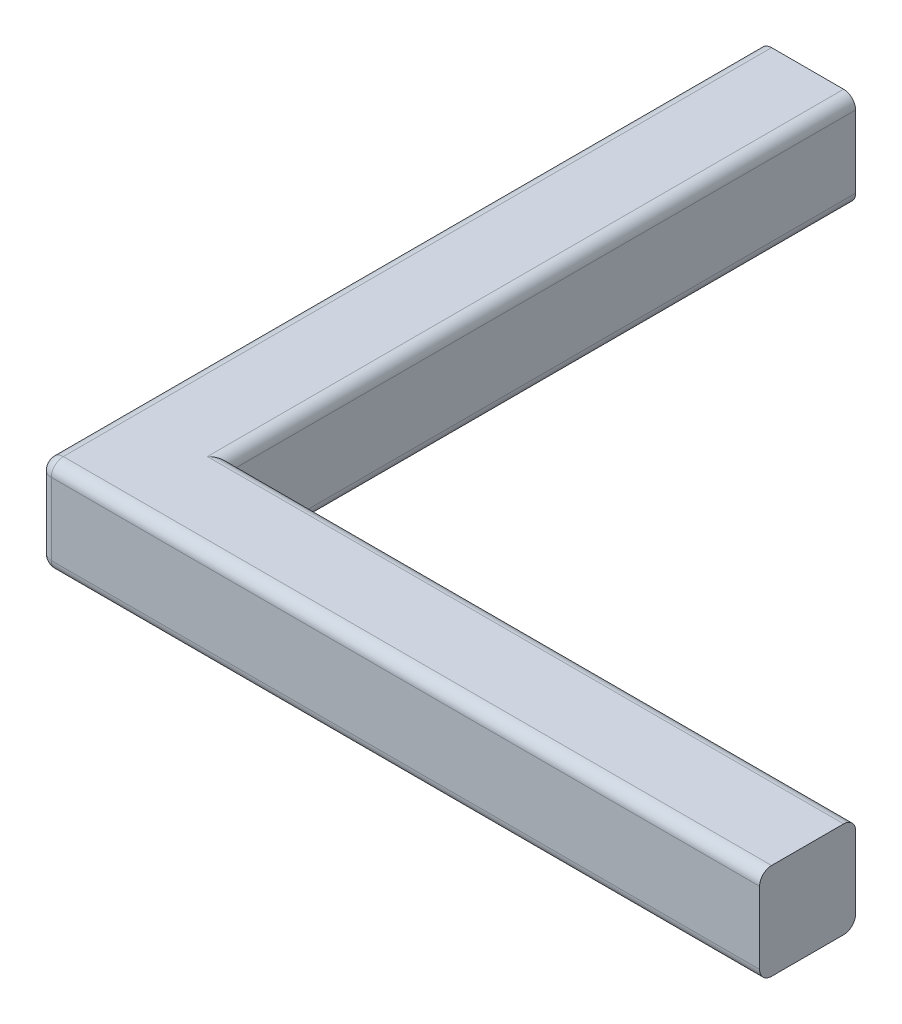
ISO-10303-21;
HEADER;
FILE_DESCRIPTION(('STEP AP214'),'2;1');
FILE_NAME('part.step','',(''),(''),'','','');
FILE_SCHEMA(('AUTOMOTIVE_DESIGN { 1 0 10303 214 1 1 1 1 }'));
ENDSEC;
DATA;
#1=APPLICATION_CONTEXT('core data for automotive mechanical design processes');
#2=APPLICATION_PROTOCOL_DEFINITION('international standard','automotive_design',2000,#1);
#3=PRODUCT_CONTEXT('',#1,'mechanical');
#4=PRODUCT('Part','Part','',(#3));
#5=PRODUCT_RELATED_PRODUCT_CATEGORY('part','',(#4));
#6=PRODUCT_DEFINITION_FORMATION('','',#4);
#7=PRODUCT_DEFINITION_CONTEXT('part definition',#1,'design');
#8=PRODUCT_DEFINITION('design','',#6,#7);
#9=PRODUCT_DEFINITION_SHAPE('','',#8);
#10=(LENGTH_UNIT() NAMED_UNIT(*) SI_UNIT(.MILLI.,.METRE.));
#11=(NAMED_UNIT(*) PLANE_ANGLE_UNIT() SI_UNIT($,.RADIAN.));
#12=(NAMED_UNIT(*) SI_UNIT($,.STERADIAN.) SOLID_ANGLE_UNIT());
#13=UNCERTAINTY_MEASURE_WITH_UNIT(LENGTH_MEASURE(1.E-05),#10,'distance_accuracy_value','');
#14=(GEOMETRIC_REPRESENTATION_CONTEXT(3) GLOBAL_UNCERTAINTY_ASSIGNED_CONTEXT((#13)) GLOBAL_UNIT_ASSIGNED_CONTEXT((#10,
#11,#12)) REPRESENTATION_CONTEXT('',''));
#15=CARTESIAN_POINT('',(0.,0.,0.));
#16=DIRECTION('',(0.,0.,1.));
#17=DIRECTION('',(1.,0.,0.));
#18=AXIS2_PLACEMENT_3D('',#15,#16,#17);
#19=CARTESIAN_POINT('',(0.,40.,0.));
#20=DIRECTION('',(0.,0.,-1.));
#21=DIRECTION('',(-1.,0.,0.));
#22=AXIS2_PLACEMENT_3D('',#19,#20,#21);
#23=PLANE('',#22);
#24=DIRECTION('',(1.,0.,0.));
#25=VECTOR('',#24,1.);
#26=CARTESIAN_POINT('',(0.,35.,0.));
#27=LINE('',#26,#25);
#28=CARTESIAN_POINT('',(300.,35.,0.));
#29=VERTEX_POINT('',#28);
#30=CARTESIAN_POINT('',(5.,35.,0.));
#31=VERTEX_POINT('',#30);
#32=EDGE_CURVE('E148',#29,#31,#27,.F.);
#33=ORIENTED_EDGE('',*,*,#32,.T.);
#34=DIRECTION('',(0.,-1.,0.));
#35=VECTOR('',#34,1.);
#36=CARTESIAN_POINT('',(5.,40.,0.));
#37=LINE('',#36,#35);
#38=CARTESIAN_POINT('',(5.,5.,0.));
#39=VERTEX_POINT('',#38);
#40=EDGE_CURVE('E212',#31,#39,#37,.T.);
#41=ORIENTED_EDGE('',*,*,#40,.T.);
#42=DIRECTION('',(1.,0.,0.));
#43=VECTOR('',#42,1.);
#44=CARTESIAN_POINT('',(300.,5.,0.));
#45=LINE('',#44,#43);
#46=CARTESIAN_POINT('',(300.,5.,0.));
#47=VERTEX_POINT('',#46);
#48=EDGE_CURVE('E182',#39,#47,#45,.T.);
#49=ORIENTED_EDGE('',*,*,#48,.T.);
#50=DIRECTION('',(0.,-1.,0.));
#51=VECTOR('',#50,1.);
#52=CARTESIAN_POINT('',(300.,40.,0.));
#53=LINE('',#52,#51);
#54=EDGE_CURVE('E143',#29,#47,#53,.T.);
#55=ORIENTED_EDGE('',*,*,#54,.F.);
#56=EDGE_LOOP('',(#33,#41,#49,#55));
#57=FACE_BOUND('',#56,.T.);
#58=ADVANCED_FACE('F34',(#57),#23,.F.);
#59=CARTESIAN_POINT('',(300.,40.,0.));
#60=DIRECTION('',(-1.,0.,0.));
#61=DIRECTION('',(0.,0.,1.));
#62=AXIS2_PLACEMENT_3D('',#59,#60,#61);
#63=PLANE('',#62);
#64=DIRECTION('',(0.,0.,-1.));
#65=VECTOR('',#64,1.);
#66=CARTESIAN_POINT('',(300.,0.,0.));
#67=LINE('',#66,#65);
#68=CARTESIAN_POINT('',(300.,0.,-5.));
#69=VERTEX_POINT('',#68);
#70=CARTESIAN_POINT('',(300.,0.,-35.));
#71=VERTEX_POINT('',#70);
#72=EDGE_CURVE('E164',#69,#71,#67,.T.);
#73=ORIENTED_EDGE('',*,*,#72,.T.);
#74=CARTESIAN_POINT('',(300.,5.,-35.));
#75=DIRECTION('',(-1.,0.,0.));
#76=DIRECTION('',(0.,0.,1.));
#77=AXIS2_PLACEMENT_3D('',#74,#75,#76);
#78=CIRCLE('',#77,5.);
#79=CARTESIAN_POINT('',(300.,5.,-40.));
#80=VERTEX_POINT('',#79);
#81=EDGE_CURVE('E229',#71,#80,#78,.F.);
#82=ORIENTED_EDGE('',*,*,#81,.T.);
#83=DIRECTION('',(0.,-1.,0.));
#84=VECTOR('',#83,1.);
#85=CARTESIAN_POINT('',(300.,40.,-40.));
#86=LINE('',#85,#84);
#87=CARTESIAN_POINT('',(300.,35.,-40.));
#88=VERTEX_POINT('',#87);
#89=EDGE_CURVE('E177',#88,#80,#86,.T.);
#90=ORIENTED_EDGE('',*,*,#89,.F.);
#91=CARTESIAN_POINT('',(300.,35.,-35.));
#92=DIRECTION('',(-1.,0.,0.));
#93=DIRECTION('',(0.,0.,1.));
#94=AXIS2_PLACEMENT_3D('',#91,#92,#93);
#95=CIRCLE('',#94,5.);
#96=CARTESIAN_POINT('',(300.,40.,-35.));
#97=VERTEX_POINT('',#96);
#98=EDGE_CURVE('E157',#88,#97,#95,.F.);
#99=ORIENTED_EDGE('',*,*,#98,.T.);
#100=DIRECTION('',(0.,0.,-1.));
#101=VECTOR('',#100,1.);
#102=CARTESIAN_POINT('',(300.,40.,0.));
#103=LINE('',#102,#101);
#104=CARTESIAN_POINT('',(300.,40.,-5.));
#105=VERTEX_POINT('',#104);
#106=EDGE_CURVE('E137',#105,#97,#103,.T.);
#107=ORIENTED_EDGE('',*,*,#106,.F.);
#108=CARTESIAN_POINT('',(300.,35.,-5.));
#109=DIRECTION('',(-1.,0.,0.));
#110=DIRECTION('',(0.,0.,1.));
#111=AXIS2_PLACEMENT_3D('',#108,#109,#110);
#112=CIRCLE('',#111,5.);
#113=EDGE_CURVE('E142',#105,#29,#112,.F.);
#114=ORIENTED_EDGE('',*,*,#113,.T.);
#115=ORIENTED_EDGE('',*,*,#54,.T.);
#116=CARTESIAN_POINT('',(300.,5.,-5.));
#117=DIRECTION('',(-1.,0.,0.));
#118=DIRECTION('',(0.,0.,1.));
#119=AXIS2_PLACEMENT_3D('',#116,#117,#118);
#120=CIRCLE('',#119,5.);
#121=EDGE_CURVE('E185',#47,#69,#120,.F.);
#122=ORIENTED_EDGE('',*,*,#121,.T.);
#123=EDGE_LOOP('',(#73,#82,#90,#99,#107,#114,#115,#122));
#124=FACE_BOUND('',#123,.T.);
#125=ADVANCED_FACE('F154',(#124),#63,.F.);
#126=CARTESIAN_POINT('',(40.,40.,-40.));
#127=DIRECTION('',(0.,0.,1.));
#128=DIRECTION('',(1.,0.,0.));
#129=AXIS2_PLACEMENT_3D('',#126,#127,#128);
#130=PLANE('',#129);
#131=ORIENTED_EDGE('',*,*,#89,.T.);
#132=DIRECTION('',(-1.,0.,0.));
#133=VECTOR('',#132,1.);
#134=CARTESIAN_POINT('',(35.,5.,-40.));
#135=LINE('',#134,#133);
#136=CARTESIAN_POINT('',(40.,5.,-40.));
#137=VERTEX_POINT('',#136);
#138=EDGE_CURVE('E222',#80,#137,#135,.T.);
#139=ORIENTED_EDGE('',*,*,#138,.T.);
#140=DIRECTION('',(0.,-1.,0.));
#141=VECTOR('',#140,1.);
#142=CARTESIAN_POINT('',(40.,40.,-40.));
#143=LINE('',#142,#141);
#144=CARTESIAN_POINT('',(40.,35.,-40.));
#145=VERTEX_POINT('',#144);
#146=EDGE_CURVE('E174',#145,#137,#143,.T.);
#147=ORIENTED_EDGE('',*,*,#146,.F.);
#148=DIRECTION('',(-1.,0.,0.));
#149=VECTOR('',#148,1.);
#150=CARTESIAN_POINT('',(40.,35.,-40.));
#151=LINE('',#150,#149);
#152=EDGE_CURVE('E205',#145,#88,#151,.F.);
#153=ORIENTED_EDGE('',*,*,#152,.T.);
#154=EDGE_LOOP('',(#131,#139,#147,#153));
#155=FACE_BOUND('',#154,.T.);
#156=ADVANCED_FACE('F279',(#155),#130,.F.);
#157=CARTESIAN_POINT('',(40.,40.,-40.));
#158=DIRECTION('',(-1.,0.,0.));
#159=DIRECTION('',(0.,0.,1.));
#160=AXIS2_PLACEMENT_3D('',#157,#158,#159);
#161=PLANE('',#160);
#162=ORIENTED_EDGE('',*,*,#146,.T.);
#163=DIRECTION('',(0.,0.,-1.));
#164=VECTOR('',#163,1.);
#165=CARTESIAN_POINT('',(40.,5.,-300.));
#166=LINE('',#165,#164);
#167=CARTESIAN_POINT('',(40.,5.,-300.));
#168=VERTEX_POINT('',#167);
#169=EDGE_CURVE('E193',#137,#168,#166,.T.);
#170=ORIENTED_EDGE('',*,*,#169,.T.);
#171=DIRECTION('',(0.,-1.,0.));
#172=VECTOR('',#171,1.);
#173=CARTESIAN_POINT('',(40.,40.,-300.));
#174=LINE('',#173,#172);
#175=CARTESIAN_POINT('',(40.,35.,-300.));
#176=VERTEX_POINT('',#175);
#177=EDGE_CURVE('E171',#176,#168,#174,.T.);
#178=ORIENTED_EDGE('',*,*,#177,.F.);
#179=DIRECTION('',(0.,0.,-1.));
#180=VECTOR('',#179,1.);
#181=CARTESIAN_POINT('',(40.,35.,-40.));
#182=LINE('',#181,#180);
#183=EDGE_CURVE('E191',#176,#145,#182,.F.);
#184=ORIENTED_EDGE('',*,*,#183,.T.);
#185=EDGE_LOOP('',(#162,#170,#178,#184));
#186=FACE_BOUND('',#185,.T.);
#187=ADVANCED_FACE('F283',(#186),#161,.F.);
#188=CARTESIAN_POINT('',(0.,40.,-300.));
#189=DIRECTION('',(0.,0.,1.));
#190=DIRECTION('',(1.,0.,0.));
#191=AXIS2_PLACEMENT_3D('',#188,#189,#190);
#192=PLANE('',#191);
#193=DIRECTION('',(-1.,0.,0.));
#194=VECTOR('',#193,1.);
#195=CARTESIAN_POINT('',(0.,0.,-300.));
#196=LINE('',#195,#194);
#197=CARTESIAN_POINT('',(35.,0.,-300.));
#198=VERTEX_POINT('',#197);
#199=CARTESIAN_POINT('',(5.,0.,-300.));
#200=VERTEX_POINT('',#199);
#201=EDGE_CURVE('E159',#198,#200,#196,.T.);
#202=ORIENTED_EDGE('',*,*,#201,.T.);
#203=CARTESIAN_POINT('',(5.,5.,-300.));
#204=DIRECTION('',(0.,0.,1.));
#205=DIRECTION('',(1.,0.,0.));
#206=AXIS2_PLACEMENT_3D('',#203,#204,#205);
#207=CIRCLE('',#206,5.);
#208=CARTESIAN_POINT('',(0.,5.,-300.));
#209=VERTEX_POINT('',#208);
#210=EDGE_CURVE('E232',#200,#209,#207,.F.);
#211=ORIENTED_EDGE('',*,*,#210,.T.);
#212=DIRECTION('',(0.,-1.,0.));
#213=VECTOR('',#212,1.);
#214=CARTESIAN_POINT('',(0.,40.,-300.));
#215=LINE('',#214,#213);
#216=CARTESIAN_POINT('',(0.,35.,-300.));
#217=VERTEX_POINT('',#216);
#218=EDGE_CURVE('E161',#217,#209,#215,.T.);
#219=ORIENTED_EDGE('',*,*,#218,.F.);
#220=CARTESIAN_POINT('',(5.,35.,-300.));
#221=DIRECTION('',(0.,0.,1.));
#222=DIRECTION('',(1.,0.,0.));
#223=AXIS2_PLACEMENT_3D('',#220,#221,#222);
#224=CIRCLE('',#223,5.);
#225=CARTESIAN_POINT('',(5.,40.,-300.));
#226=VERTEX_POINT('',#225);
#227=EDGE_CURVE('E51',#217,#226,#224,.F.);
#228=ORIENTED_EDGE('',*,*,#227,.T.);
#229=DIRECTION('',(-1.,0.,0.));
#230=VECTOR('',#229,1.);
#231=CARTESIAN_POINT('',(0.,40.,-300.));
#232=LINE('',#231,#230);
#233=CARTESIAN_POINT('',(35.,40.,-300.));
#234=VERTEX_POINT('',#233);
#235=EDGE_CURVE('E158',#234,#226,#232,.T.);
#236=ORIENTED_EDGE('',*,*,#235,.F.);
#237=CARTESIAN_POINT('',(35.,35.,-300.));
#238=DIRECTION('',(0.,0.,1.));
#239=DIRECTION('',(1.,0.,0.));
#240=AXIS2_PLACEMENT_3D('',#237,#238,#239);
#241=CIRCLE('',#240,5.);
#242=EDGE_CURVE('E196',#234,#176,#241,.F.);
#243=ORIENTED_EDGE('',*,*,#242,.T.);
#244=ORIENTED_EDGE('',*,*,#177,.T.);
#245=CARTESIAN_POINT('',(35.,5.,-300.));
#246=DIRECTION('',(0.,0.,1.));
#247=DIRECTION('',(1.,0.,0.));
#248=AXIS2_PLACEMENT_3D('',#245,#246,#247);
#249=CIRCLE('',#248,5.);
#250=EDGE_CURVE('E198',#168,#198,#249,.F.);
#251=ORIENTED_EDGE('',*,*,#250,.T.);
#252=EDGE_LOOP('',(#202,#211,#219,#228,#236,#243,#244,#251));
#253=FACE_BOUND('',#252,.T.);
#254=ADVANCED_FACE('F255',(#253),#192,.F.);
#255=CARTESIAN_POINT('',(0.,40.,-40.));
#256=DIRECTION('',(1.,0.,0.));
#257=DIRECTION('',(0.,0.,-1.));
#258=AXIS2_PLACEMENT_3D('',#255,#256,#257);
#259=PLANE('',#258);
#260=ORIENTED_EDGE('',*,*,#218,.T.);
#261=DIRECTION('',(0.,0.,1.));
#262=VECTOR('',#261,1.);
#263=CARTESIAN_POINT('',(0.,5.,-5.));
#264=LINE('',#263,#262);
#265=CARTESIAN_POINT('',(0.,5.,-5.));
#266=VERTEX_POINT('',#265);
#267=EDGE_CURVE('E218',#209,#266,#264,.T.);
#268=ORIENTED_EDGE('',*,*,#267,.T.);
#269=DIRECTION('',(0.,-1.,0.));
#270=VECTOR('',#269,1.);
#271=CARTESIAN_POINT('',(0.,40.,-5.));
#272=LINE('',#271,#270);
#273=CARTESIAN_POINT('',(0.,35.,-5.));
#274=VERTEX_POINT('',#273);
#275=EDGE_CURVE('E216',#266,#274,#272,.F.);
#276=ORIENTED_EDGE('',*,*,#275,.T.);
#277=DIRECTION('',(0.,0.,1.));
#278=VECTOR('',#277,1.);
#279=CARTESIAN_POINT('',(0.,35.,-40.));
#280=LINE('',#279,#278);
#281=EDGE_CURVE('E214',#274,#217,#280,.F.);
#282=ORIENTED_EDGE('',*,*,#281,.T.);
#283=EDGE_LOOP('',(#260,#268,#276,#282));
#284=FACE_BOUND('',#283,.T.);
#285=ADVANCED_FACE('F253',(#284),#259,.F.);
#286=CARTESIAN_POINT('',(0.,40.,0.));
#287=DIRECTION('',(0.,-1.,0.));
#288=DIRECTION('',(0.,0.,-1.));
#289=AXIS2_PLACEMENT_3D('',#286,#287,#288);
#290=PLANE('',#289);
#291=ORIENTED_EDGE('',*,*,#235,.T.);
#292=DIRECTION('',(0.,0.,1.));
#293=VECTOR('',#292,1.);
#294=CARTESIAN_POINT('',(5.,40.,0.));
#295=LINE('',#294,#293);
#296=CARTESIAN_POINT('',(5.,40.,-5.));
#297=VERTEX_POINT('',#296);
#298=EDGE_CURVE('E43',#226,#297,#295,.T.);
#299=ORIENTED_EDGE('',*,*,#298,.T.);
#300=DIRECTION('',(1.,0.,0.));
#301=VECTOR('',#300,1.);
#302=CARTESIAN_POINT('',(0.,40.,-5.));
#303=LINE('',#302,#301);
#304=EDGE_CURVE('E133',#297,#105,#303,.T.);
#305=ORIENTED_EDGE('',*,*,#304,.T.);
#306=ORIENTED_EDGE('',*,*,#106,.T.);
#307=DIRECTION('',(-1.,0.,0.));
#308=VECTOR('',#307,1.);
#309=CARTESIAN_POINT('',(0.,40.,-35.));
#310=LINE('',#309,#308);
#311=CARTESIAN_POINT('',(35.,40.,-35.));
#312=VERTEX_POINT('',#311);
#313=EDGE_CURVE('E200',#97,#312,#310,.T.);
#314=ORIENTED_EDGE('',*,*,#313,.T.);
#315=DIRECTION('',(0.,0.,-1.));
#316=VECTOR('',#315,1.);
#317=CARTESIAN_POINT('',(35.,40.,0.));
#318=LINE('',#317,#316);
#319=EDGE_CURVE('E202',#312,#234,#318,.T.);
#320=ORIENTED_EDGE('',*,*,#319,.T.);
#321=EDGE_LOOP('',(#291,#299,#305,#306,#314,#320));
#322=FACE_BOUND('',#321,.T.);
#323=ADVANCED_FACE('F135',(#322),#290,.F.);
#324=CARTESIAN_POINT('',(0.,0.,0.));
#325=DIRECTION('',(0.,-1.,0.));
#326=DIRECTION('',(0.,0.,-1.));
#327=AXIS2_PLACEMENT_3D('',#324,#325,#326);
#328=PLANE('',#327);
#329=DIRECTION('',(0.,0.,-1.));
#330=VECTOR('',#329,1.);
#331=CARTESIAN_POINT('',(35.,0.,-40.));
#332=LINE('',#331,#330);
#333=CARTESIAN_POINT('',(35.,0.,-35.));
#334=VERTEX_POINT('',#333);
#335=EDGE_CURVE('E59',#198,#334,#332,.F.);
#336=ORIENTED_EDGE('',*,*,#335,.T.);
#337=DIRECTION('',(-1.,0.,0.));
#338=VECTOR('',#337,1.);
#339=CARTESIAN_POINT('',(300.,0.,-35.));
#340=LINE('',#339,#338);
#341=EDGE_CURVE('E227',#334,#71,#340,.F.);
#342=ORIENTED_EDGE('',*,*,#341,.T.);
#343=ORIENTED_EDGE('',*,*,#72,.F.);
#344=DIRECTION('',(1.,0.,0.));
#345=VECTOR('',#344,1.);
#346=CARTESIAN_POINT('',(0.,0.,-5.));
#347=LINE('',#346,#345);
#348=CARTESIAN_POINT('',(5.,0.,-5.));
#349=VERTEX_POINT('',#348);
#350=EDGE_CURVE('E188',#69,#349,#347,.F.);
#351=ORIENTED_EDGE('',*,*,#350,.T.);
#352=DIRECTION('',(0.,0.,1.));
#353=VECTOR('',#352,1.);
#354=CARTESIAN_POINT('',(5.,0.,-300.));
#355=LINE('',#354,#353);
#356=EDGE_CURVE('E225',#349,#200,#355,.F.);
#357=ORIENTED_EDGE('',*,*,#356,.T.);
#358=ORIENTED_EDGE('',*,*,#201,.F.);
#359=EDGE_LOOP('',(#336,#342,#343,#351,#357,#358));
#360=FACE_BOUND('',#359,.T.);
#361=ADVANCED_FACE('F272',(#360),#328,.T.);
#362=CARTESIAN_POINT('',(0.,35.,-5.));
#363=DIRECTION('',(1.,0.,0.));
#364=DIRECTION('',(0.,0.,-1.));
#365=AXIS2_PLACEMENT_3D('',#362,#363,#364);
#366=CYLINDRICAL_SURFACE('',#365,5.);
#367=ORIENTED_EDGE('',*,*,#304,.F.);
#368=CARTESIAN_POINT('',(5.,35.,-5.));
#369=DIRECTION('',(1.,0.,0.));
#370=DIRECTION('',(0.,0.,-1.));
#371=AXIS2_PLACEMENT_3D('',#368,#369,#370);
#372=CIRCLE('',#371,5.);
#373=EDGE_CURVE('E220',#297,#31,#372,.T.);
#374=ORIENTED_EDGE('',*,*,#373,.T.);
#375=ORIENTED_EDGE('',*,*,#32,.F.);
#376=ORIENTED_EDGE('',*,*,#113,.F.);
#377=EDGE_LOOP('',(#367,#374,#375,#376));
#378=FACE_BOUND('',#377,.T.);
#379=ADVANCED_FACE('F146',(#378),#366,.T.);
#380=CARTESIAN_POINT('',(0.,5.,-5.));
#381=DIRECTION('',(-1.,0.,0.));
#382=DIRECTION('',(0.,0.,1.));
#383=AXIS2_PLACEMENT_3D('',#380,#381,#382);
#384=CYLINDRICAL_SURFACE('',#383,5.);
#385=ORIENTED_EDGE('',*,*,#48,.F.);
#386=CARTESIAN_POINT('',(5.,5.,-5.));
#387=DIRECTION('',(-1.,0.,0.));
#388=DIRECTION('',(0.,0.,1.));
#389=AXIS2_PLACEMENT_3D('',#386,#387,#388);
#390=CIRCLE('',#389,5.);
#391=EDGE_CURVE('E207',#39,#349,#390,.F.);
#392=ORIENTED_EDGE('',*,*,#391,.T.);
#393=ORIENTED_EDGE('',*,*,#350,.F.);
#394=ORIENTED_EDGE('',*,*,#121,.F.);
#395=EDGE_LOOP('',(#385,#392,#393,#394));
#396=FACE_BOUND('',#395,.T.);
#397=ADVANCED_FACE('F269',(#396),#384,.T.);
#398=CARTESIAN_POINT('',(35.,5.,-40.));
#399=DIRECTION('',(0.,0.,1.));
#400=DIRECTION('',(1.,0.,0.));
#401=AXIS2_PLACEMENT_3D('',#398,#399,#400);
#402=CYLINDRICAL_SURFACE('',#401,5.);
#403=ORIENTED_EDGE('',*,*,#169,.F.);
#404=CARTESIAN_POINT('',(35.,5.,-35.));
#405=DIRECTION('',(0.707106781186547,0.,0.707106781186547));
#406=DIRECTION('',(0.707106781186547,0.,-0.707106781186547));
#407=AXIS2_PLACEMENT_3D('',#404,#405,#406);
#408=ELLIPSE('',#407,7.07106781186547,5.);
#409=EDGE_CURVE('E11',#137,#334,#408,.F.);
#410=ORIENTED_EDGE('',*,*,#409,.T.);
#411=ORIENTED_EDGE('',*,*,#335,.F.);
#412=ORIENTED_EDGE('',*,*,#250,.F.);
#413=EDGE_LOOP('',(#403,#410,#411,#412));
#414=FACE_BOUND('',#413,.T.);
#415=ADVANCED_FACE('F287',(#414),#402,.T.);
#416=CARTESIAN_POINT('',(0.,35.,-35.));
#417=DIRECTION('',(-1.,0.,0.));
#418=DIRECTION('',(0.,0.,1.));
#419=AXIS2_PLACEMENT_3D('',#416,#417,#418);
#420=CYLINDRICAL_SURFACE('',#419,5.);
#421=ORIENTED_EDGE('',*,*,#98,.F.);
#422=ORIENTED_EDGE('',*,*,#152,.F.);
#423=CARTESIAN_POINT('',(35.,35.,-35.));
#424=DIRECTION('',(-0.707106781186547,0.,-0.707106781186547));
#425=DIRECTION('',(0.707106781186547,0.,-0.707106781186547));
#426=AXIS2_PLACEMENT_3D('',#423,#424,#425);
#427=ELLIPSE('',#426,7.07106781186547,5.);
#428=EDGE_CURVE('E167',#312,#145,#427,.T.);
#429=ORIENTED_EDGE('',*,*,#428,.F.);
#430=ORIENTED_EDGE('',*,*,#313,.F.);
#431=EDGE_LOOP('',(#421,#422,#429,#430));
#432=FACE_BOUND('',#431,.T.);
#433=ADVANCED_FACE('F293',(#432),#420,.T.);
#434=CARTESIAN_POINT('',(35.,35.,0.));
#435=DIRECTION('',(0.,0.,-1.));
#436=DIRECTION('',(-1.,0.,0.));
#437=AXIS2_PLACEMENT_3D('',#434,#435,#436);
#438=CYLINDRICAL_SURFACE('',#437,5.);
#439=ORIENTED_EDGE('',*,*,#428,.T.);
#440=ORIENTED_EDGE('',*,*,#183,.F.);
#441=ORIENTED_EDGE('',*,*,#242,.F.);
#442=ORIENTED_EDGE('',*,*,#319,.F.);
#443=EDGE_LOOP('',(#439,#440,#441,#442));
#444=FACE_BOUND('',#443,.T.);
#445=ADVANCED_FACE('F289',(#444),#438,.T.);
#446=CARTESIAN_POINT('',(5.,35.,0.));
#447=DIRECTION('',(0.,0.,1.));
#448=DIRECTION('',(1.,0.,0.));
#449=AXIS2_PLACEMENT_3D('',#446,#447,#448);
#450=CYLINDRICAL_SURFACE('',#449,5.);
#451=CARTESIAN_POINT('',(5.,35.,-5.));
#452=DIRECTION('',(0.,0.,1.));
#453=DIRECTION('',(1.,0.,0.));
#454=AXIS2_PLACEMENT_3D('',#451,#452,#453);
#455=CIRCLE('',#454,5.);
#456=EDGE_CURVE('E38',#297,#274,#455,.T.);
#457=ORIENTED_EDGE('',*,*,#456,.F.);
#458=ORIENTED_EDGE('',*,*,#298,.F.);
#459=ORIENTED_EDGE('',*,*,#227,.F.);
#460=ORIENTED_EDGE('',*,*,#281,.F.);
#461=EDGE_LOOP('',(#457,#458,#459,#460));
#462=FACE_BOUND('',#461,.T.);
#463=ADVANCED_FACE('F251',(#462),#450,.T.);
#464=CARTESIAN_POINT('',(5.,35.,-5.));
#465=DIRECTION('',(1.,0.,0.));
#466=DIRECTION('',(0.,0.,-1.));
#467=AXIS2_PLACEMENT_3D('',#464,#465,#466);
#468=SPHERICAL_SURFACE('',#467,5.);
#469=ORIENTED_EDGE('',*,*,#373,.F.);
#470=ORIENTED_EDGE('',*,*,#456,.T.);
#471=CARTESIAN_POINT('',(5.,35.,-5.));
#472=DIRECTION('',(0.,-1.,0.));
#473=DIRECTION('',(0.,0.,-1.));
#474=AXIS2_PLACEMENT_3D('',#471,#472,#473);
#475=CIRCLE('',#474,5.);
#476=EDGE_CURVE('E239',#31,#274,#475,.T.);
#477=ORIENTED_EDGE('',*,*,#476,.F.);
#478=EDGE_LOOP('',(#469,#470,#477));
#479=FACE_BOUND('',#478,.T.);
#480=ADVANCED_FACE('F248',(#479),#468,.T.);
#481=CARTESIAN_POINT('',(5.,5.,-40.));
#482=DIRECTION('',(0.,0.,-1.));
#483=DIRECTION('',(-1.,0.,0.));
#484=AXIS2_PLACEMENT_3D('',#481,#482,#483);
#485=CYLINDRICAL_SURFACE('',#484,5.);
#486=ORIENTED_EDGE('',*,*,#210,.F.);
#487=ORIENTED_EDGE('',*,*,#356,.F.);
#488=CARTESIAN_POINT('',(5.,5.,-5.));
#489=DIRECTION('',(0.,0.,1.));
#490=DIRECTION('',(1.,0.,0.));
#491=AXIS2_PLACEMENT_3D('',#488,#489,#490);
#492=CIRCLE('',#491,5.);
#493=EDGE_CURVE('E238',#266,#349,#492,.T.);
#494=ORIENTED_EDGE('',*,*,#493,.F.);
#495=ORIENTED_EDGE('',*,*,#267,.F.);
#496=EDGE_LOOP('',(#486,#487,#494,#495));
#497=FACE_BOUND('',#496,.T.);
#498=ADVANCED_FACE('F259',(#497),#485,.T.);
#499=CARTESIAN_POINT('',(5.,40.,-5.));
#500=DIRECTION('',(0.,-1.,0.));
#501=DIRECTION('',(0.,0.,-1.));
#502=AXIS2_PLACEMENT_3D('',#499,#500,#501);
#503=CYLINDRICAL_SURFACE('',#502,5.);
#504=ORIENTED_EDGE('',*,*,#476,.T.);
#505=ORIENTED_EDGE('',*,*,#275,.F.);
#506=CARTESIAN_POINT('',(5.,5.,-5.));
#507=DIRECTION('',(0.,-1.,0.));
#508=DIRECTION('',(0.,0.,-1.));
#509=AXIS2_PLACEMENT_3D('',#506,#507,#508);
#510=CIRCLE('',#509,5.);
#511=EDGE_CURVE('E235',#39,#266,#510,.T.);
#512=ORIENTED_EDGE('',*,*,#511,.F.);
#513=ORIENTED_EDGE('',*,*,#40,.F.);
#514=EDGE_LOOP('',(#504,#505,#512,#513));
#515=FACE_BOUND('',#514,.T.);
#516=ADVANCED_FACE('F262',(#515),#503,.T.);
#517=CARTESIAN_POINT('',(5.,5.,-5.));
#518=DIRECTION('',(1.,0.,0.));
#519=DIRECTION('',(0.,0.,-1.));
#520=AXIS2_PLACEMENT_3D('',#517,#518,#519);
#521=SPHERICAL_SURFACE('',#520,5.);
#522=ORIENTED_EDGE('',*,*,#493,.T.);
#523=ORIENTED_EDGE('',*,*,#391,.F.);
#524=ORIENTED_EDGE('',*,*,#511,.T.);
#525=EDGE_LOOP('',(#522,#523,#524));
#526=FACE_BOUND('',#525,.T.);
#527=ADVANCED_FACE('F265',(#526),#521,.T.);
#528=CARTESIAN_POINT('',(40.,5.,-35.));
#529=DIRECTION('',(1.,0.,0.));
#530=DIRECTION('',(0.,0.,-1.));
#531=AXIS2_PLACEMENT_3D('',#528,#529,#530);
#532=CYLINDRICAL_SURFACE('',#531,5.);
#533=ORIENTED_EDGE('',*,*,#81,.F.);
#534=ORIENTED_EDGE('',*,*,#341,.F.);
#535=ORIENTED_EDGE('',*,*,#409,.F.);
#536=ORIENTED_EDGE('',*,*,#138,.F.);
#537=EDGE_LOOP('',(#533,#534,#535,#536));
#538=FACE_BOUND('',#537,.T.);
#539=ADVANCED_FACE('F36',(#538),#532,.T.);
#540=CLOSED_SHELL('',(#58,#125,#156,#187,#254,#285,#323,#361,#379,#397,#415,#433,#445,#463,#480,
#498,#516,#527,#539));
#541=MANIFOLD_SOLID_BREP('B2',#540);
#542=ADVANCED_BREP_SHAPE_REPRESENTATION('',(#18,#541),#14);
#543=SHAPE_DEFINITION_REPRESENTATION(#9,#542);
ENDSEC;
END-ISO-10303-21;
